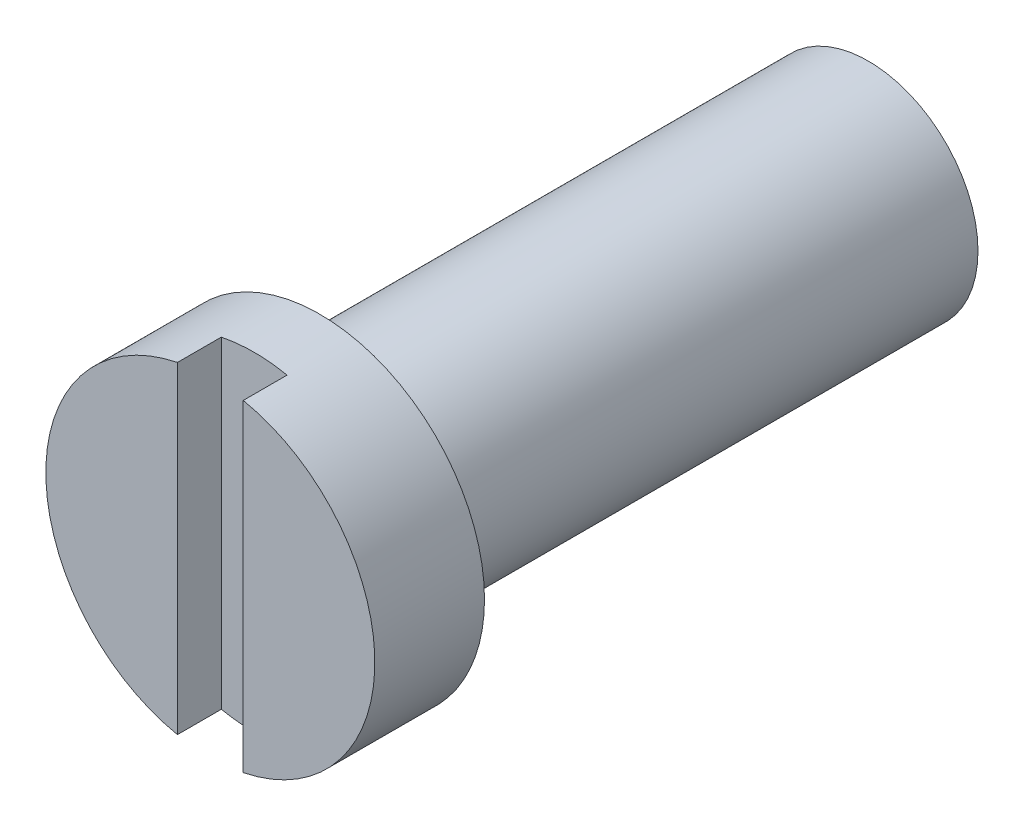
ISO-10303-21;
HEADER;
FILE_DESCRIPTION(('STEP AP214'),'2;1');
FILE_NAME('part.step','',(''),(''),'','','');
FILE_SCHEMA(('AUTOMOTIVE_DESIGN { 1 0 10303 214 1 1 1 1 }'));
ENDSEC;
DATA;
#1=APPLICATION_CONTEXT('core data for automotive mechanical design processes');
#2=APPLICATION_PROTOCOL_DEFINITION('international standard','automotive_design',2000,#1);
#3=PRODUCT_CONTEXT('',#1,'mechanical');
#4=PRODUCT('Part','Part','',(#3));
#5=PRODUCT_RELATED_PRODUCT_CATEGORY('part','',(#4));
#6=PRODUCT_DEFINITION_FORMATION('','',#4);
#7=PRODUCT_DEFINITION_CONTEXT('part definition',#1,'design');
#8=PRODUCT_DEFINITION('design','',#6,#7);
#9=PRODUCT_DEFINITION_SHAPE('','',#8);
#10=(LENGTH_UNIT() NAMED_UNIT(*) SI_UNIT(.MILLI.,.METRE.));
#11=(NAMED_UNIT(*) PLANE_ANGLE_UNIT() SI_UNIT($,.RADIAN.));
#12=(NAMED_UNIT(*) SI_UNIT($,.STERADIAN.) SOLID_ANGLE_UNIT());
#13=UNCERTAINTY_MEASURE_WITH_UNIT(LENGTH_MEASURE(1.E-05),#10,'distance_accuracy_value','');
#14=(GEOMETRIC_REPRESENTATION_CONTEXT(3) GLOBAL_UNCERTAINTY_ASSIGNED_CONTEXT((#13)) GLOBAL_UNIT_ASSIGNED_CONTEXT((#10,
#11,#12)) REPRESENTATION_CONTEXT('',''));
#15=CARTESIAN_POINT('',(0.,0.,0.));
#16=DIRECTION('',(0.,0.,1.));
#17=DIRECTION('',(1.,0.,0.));
#18=AXIS2_PLACEMENT_3D('',#15,#16,#17);
#19=CARTESIAN_POINT('',(0.,0.,3.));
#20=DIRECTION('',(0.,0.,1.));
#21=DIRECTION('',(1.,0.,0.));
#22=AXIS2_PLACEMENT_3D('',#19,#20,#21);
#23=PLANE('',#22);
#24=DIRECTION('',(0.,1.,0.));
#25=VECTOR('',#24,1.);
#26=CARTESIAN_POINT('',(0.15,0.734846922834954,3.));
#27=LINE('',#26,#25);
#28=CARTESIAN_POINT('',(0.15,-0.734846922834954,3.));
#29=VERTEX_POINT('',#28);
#30=CARTESIAN_POINT('',(0.15,0.734846922834954,3.));
#31=VERTEX_POINT('',#30);
#32=EDGE_CURVE('E72',#29,#31,#27,.T.);
#33=ORIENTED_EDGE('',*,*,#32,.F.);
#34=CARTESIAN_POINT('',(0.,0.,3.));
#35=DIRECTION('',(0.,0.,1.));
#36=DIRECTION('',(1.,0.,0.));
#37=AXIS2_PLACEMENT_3D('',#34,#35,#36);
#38=CIRCLE('',#37,0.75);
#39=EDGE_CURVE('E109',#29,#31,#38,.T.);
#40=ORIENTED_EDGE('',*,*,#39,.T.);
#41=EDGE_LOOP('',(#33,#40));
#42=FACE_BOUND('',#41,.T.);
#43=ADVANCED_FACE('F34',(#42),#23,.T.);
#44=CARTESIAN_POINT('',(0.,0.,2.5));
#45=DIRECTION('',(0.,0.,-1.));
#46=DIRECTION('',(-1.,0.,0.));
#47=AXIS2_PLACEMENT_3D('',#44,#45,#46);
#48=CYLINDRICAL_SURFACE('',#47,0.5);
#49=CARTESIAN_POINT('',(0.,0.,2.5));
#50=DIRECTION('',(0.,0.,1.));
#51=DIRECTION('',(1.,0.,0.));
#52=AXIS2_PLACEMENT_3D('',#49,#50,#51);
#53=CIRCLE('',#52,0.5);
#54=CARTESIAN_POINT('',(0.5,0.,2.5));
#55=VERTEX_POINT('',#54);
#56=EDGE_CURVE('E11',#55,#55,#53,.T.);
#57=ORIENTED_EDGE('',*,*,#56,.F.);
#58=EDGE_LOOP('',(#57));
#59=FACE_BOUND('',#58,.T.);
#60=CARTESIAN_POINT('',(0.,0.,0.));
#61=DIRECTION('',(0.,0.,1.));
#62=DIRECTION('',(1.,0.,0.));
#63=AXIS2_PLACEMENT_3D('',#60,#61,#62);
#64=CIRCLE('',#63,0.5);
#65=CARTESIAN_POINT('',(0.5,0.,0.));
#66=VERTEX_POINT('',#65);
#67=EDGE_CURVE('E38',#66,#66,#64,.T.);
#68=ORIENTED_EDGE('',*,*,#67,.T.);
#69=EDGE_LOOP('',(#68));
#70=FACE_BOUND('',#69,.T.);
#71=ADVANCED_FACE('F36',(#59,#70),#48,.T.);
#72=CARTESIAN_POINT('',(0.,0.,0.));
#73=DIRECTION('',(0.,0.,1.));
#74=DIRECTION('',(1.,0.,0.));
#75=AXIS2_PLACEMENT_3D('',#72,#73,#74);
#76=PLANE('',#75);
#77=ORIENTED_EDGE('',*,*,#67,.F.);
#78=EDGE_LOOP('',(#77));
#79=FACE_BOUND('',#78,.T.);
#80=ADVANCED_FACE('F135',(#79),#76,.F.);
#81=CARTESIAN_POINT('',(0.,0.,3.));
#82=DIRECTION('',(0.,0.,-1.));
#83=DIRECTION('',(-1.,0.,0.));
#84=AXIS2_PLACEMENT_3D('',#81,#82,#83);
#85=CYLINDRICAL_SURFACE('',#84,0.75);
#86=CARTESIAN_POINT('',(0.,0.,2.8));
#87=DIRECTION('',(0.,0.,1.));
#88=DIRECTION('',(1.,0.,0.));
#89=AXIS2_PLACEMENT_3D('',#86,#87,#88);
#90=CIRCLE('',#89,0.75);
#91=CARTESIAN_POINT('',(0.15,0.734846922834954,2.8));
#92=VERTEX_POINT('',#91);
#93=CARTESIAN_POINT('',(-0.15,0.734846922834954,2.8));
#94=VERTEX_POINT('',#93);
#95=EDGE_CURVE('E92',#92,#94,#90,.T.);
#96=ORIENTED_EDGE('',*,*,#95,.F.);
#97=DIRECTION('',(0.,0.,1.));
#98=VECTOR('',#97,1.);
#99=CARTESIAN_POINT('',(0.15,0.734846922834954,2.8));
#100=LINE('',#99,#98);
#101=EDGE_CURVE('E58',#92,#31,#100,.T.);
#102=ORIENTED_EDGE('',*,*,#101,.T.);
#103=ORIENTED_EDGE('',*,*,#39,.F.);
#104=DIRECTION('',(0.,0.,1.));
#105=VECTOR('',#104,1.);
#106=CARTESIAN_POINT('',(0.15,-0.734846922834954,2.8));
#107=LINE('',#106,#105);
#108=CARTESIAN_POINT('',(0.15,-0.734846922834954,2.8));
#109=VERTEX_POINT('',#108);
#110=EDGE_CURVE('E86',#109,#29,#107,.T.);
#111=ORIENTED_EDGE('',*,*,#110,.F.);
#112=CARTESIAN_POINT('',(0.,0.,2.8));
#113=DIRECTION('',(0.,0.,1.));
#114=DIRECTION('',(1.,0.,0.));
#115=AXIS2_PLACEMENT_3D('',#112,#113,#114);
#116=CIRCLE('',#115,0.75);
#117=CARTESIAN_POINT('',(-0.15,-0.734846922834954,2.8));
#118=VERTEX_POINT('',#117);
#119=EDGE_CURVE('E90',#118,#109,#116,.T.);
#120=ORIENTED_EDGE('',*,*,#119,.F.);
#121=DIRECTION('',(0.,0.,1.));
#122=VECTOR('',#121,1.);
#123=CARTESIAN_POINT('',(-0.15,-0.734846922834954,2.8));
#124=LINE('',#123,#122);
#125=CARTESIAN_POINT('',(-0.15,-0.734846922834954,3.));
#126=VERTEX_POINT('',#125);
#127=EDGE_CURVE('E79',#118,#126,#124,.T.);
#128=ORIENTED_EDGE('',*,*,#127,.T.);
#129=CARTESIAN_POINT('',(-0.15,0.734846922834954,3.));
#130=VERTEX_POINT('',#129);
#131=EDGE_CURVE('E112',#130,#126,#38,.T.);
#132=ORIENTED_EDGE('',*,*,#131,.F.);
#133=DIRECTION('',(0.,0.,1.));
#134=VECTOR('',#133,1.);
#135=CARTESIAN_POINT('',(-0.15,0.734846922834954,2.8));
#136=LINE('',#135,#134);
#137=EDGE_CURVE('E49',#94,#130,#136,.T.);
#138=ORIENTED_EDGE('',*,*,#137,.F.);
#139=EDGE_LOOP('',(#96,#102,#103,#111,#120,#128,#132,#138));
#140=FACE_BOUND('',#139,.T.);
#141=CARTESIAN_POINT('',(0.,0.,2.5));
#142=DIRECTION('',(0.,0.,1.));
#143=DIRECTION('',(1.,0.,0.));
#144=AXIS2_PLACEMENT_3D('',#141,#142,#143);
#145=CIRCLE('',#144,0.75);
#146=CARTESIAN_POINT('',(0.75,0.,2.5));
#147=VERTEX_POINT('',#146);
#148=EDGE_CURVE('E106',#147,#147,#145,.T.);
#149=ORIENTED_EDGE('',*,*,#148,.T.);
#150=EDGE_LOOP('',(#149));
#151=FACE_BOUND('',#150,.T.);
#152=ADVANCED_FACE('F95',(#140,#151),#85,.T.);
#153=DIRECTION('',(0.,-1.,0.));
#154=VECTOR('',#153,1.);
#155=CARTESIAN_POINT('',(-0.15,0.734846922834954,3.));
#156=LINE('',#155,#154);
#157=EDGE_CURVE('E81',#130,#126,#156,.T.);
#158=ORIENTED_EDGE('',*,*,#157,.F.);
#159=ORIENTED_EDGE('',*,*,#131,.T.);
#160=EDGE_LOOP('',(#158,#159));
#161=FACE_BOUND('',#160,.T.);
#162=ADVANCED_FACE('F119',(#161),#23,.T.);
#163=CARTESIAN_POINT('',(0.,0.,2.5));
#164=DIRECTION('',(0.,0.,1.));
#165=DIRECTION('',(1.,0.,0.));
#166=AXIS2_PLACEMENT_3D('',#163,#164,#165);
#167=PLANE('',#166);
#168=ORIENTED_EDGE('',*,*,#56,.T.);
#169=EDGE_LOOP('',(#168));
#170=FACE_BOUND('',#169,.T.);
#171=ORIENTED_EDGE('',*,*,#148,.F.);
#172=EDGE_LOOP('',(#171));
#173=FACE_BOUND('',#172,.T.);
#174=ADVANCED_FACE('F116',(#170,#173),#167,.F.);
#175=CARTESIAN_POINT('',(0.15,0.734846922834954,2.8));
#176=DIRECTION('',(1.,0.,0.));
#177=DIRECTION('',(0.,0.,-1.));
#178=AXIS2_PLACEMENT_3D('',#175,#176,#177);
#179=PLANE('',#178);
#180=ORIENTED_EDGE('',*,*,#32,.T.);
#181=ORIENTED_EDGE('',*,*,#101,.F.);
#182=DIRECTION('',(0.,1.,0.));
#183=VECTOR('',#182,1.);
#184=CARTESIAN_POINT('',(0.15,0.734846922834954,2.8));
#185=LINE('',#184,#183);
#186=EDGE_CURVE('E98',#109,#92,#185,.T.);
#187=ORIENTED_EDGE('',*,*,#186,.F.);
#188=ORIENTED_EDGE('',*,*,#110,.T.);
#189=EDGE_LOOP('',(#180,#181,#187,#188));
#190=FACE_BOUND('',#189,.T.);
#191=ADVANCED_FACE('F118',(#190),#179,.F.);
#192=CARTESIAN_POINT('',(-0.15,0.734846922834954,2.8));
#193=DIRECTION('',(-1.,0.,0.));
#194=DIRECTION('',(0.,0.,1.));
#195=AXIS2_PLACEMENT_3D('',#192,#193,#194);
#196=PLANE('',#195);
#197=ORIENTED_EDGE('',*,*,#157,.T.);
#198=ORIENTED_EDGE('',*,*,#127,.F.);
#199=DIRECTION('',(0.,-1.,0.));
#200=VECTOR('',#199,1.);
#201=CARTESIAN_POINT('',(-0.15,0.734846922834954,2.8));
#202=LINE('',#201,#200);
#203=EDGE_CURVE('E76',#94,#118,#202,.T.);
#204=ORIENTED_EDGE('',*,*,#203,.F.);
#205=ORIENTED_EDGE('',*,*,#137,.T.);
#206=EDGE_LOOP('',(#197,#198,#204,#205));
#207=FACE_BOUND('',#206,.T.);
#208=ADVANCED_FACE('F80',(#207),#196,.F.);
#209=CARTESIAN_POINT('',(0.,0.,2.8));
#210=DIRECTION('',(0.,0.,1.));
#211=DIRECTION('',(1.,0.,0.));
#212=AXIS2_PLACEMENT_3D('',#209,#210,#211);
#213=PLANE('',#212);
#214=ORIENTED_EDGE('',*,*,#95,.T.);
#215=ORIENTED_EDGE('',*,*,#203,.T.);
#216=ORIENTED_EDGE('',*,*,#119,.T.);
#217=ORIENTED_EDGE('',*,*,#186,.T.);
#218=EDGE_LOOP('',(#214,#215,#216,#217));
#219=FACE_BOUND('',#218,.T.);
#220=ADVANCED_FACE('F89',(#219),#213,.T.);
#221=CLOSED_SHELL('',(#43,#71,#80,#152,#162,#174,#191,#208,#220));
#222=MANIFOLD_SOLID_BREP('B2',#221);
#223=ADVANCED_BREP_SHAPE_REPRESENTATION('',(#18,#222),#14);
#224=SHAPE_DEFINITION_REPRESENTATION(#9,#223);
ENDSEC;
END-ISO-10303-21;
